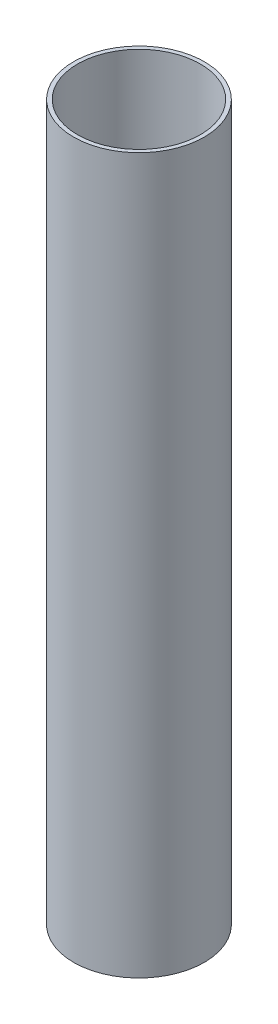
ISO-10303-21;
HEADER;
FILE_DESCRIPTION(('STEP AP214'),'2;1');
FILE_NAME('part.step','',(''),(''),'','','');
FILE_SCHEMA(('AUTOMOTIVE_DESIGN { 1 0 10303 214 1 1 1 1 }'));
ENDSEC;
DATA;
#1=APPLICATION_CONTEXT('core data for automotive mechanical design processes');
#2=APPLICATION_PROTOCOL_DEFINITION('international standard','automotive_design',2000,#1);
#3=PRODUCT_CONTEXT('',#1,'mechanical');
#4=PRODUCT('Part','Part','',(#3));
#5=PRODUCT_RELATED_PRODUCT_CATEGORY('part','',(#4));
#6=PRODUCT_DEFINITION_FORMATION('','',#4);
#7=PRODUCT_DEFINITION_CONTEXT('part definition',#1,'design');
#8=PRODUCT_DEFINITION('design','',#6,#7);
#9=PRODUCT_DEFINITION_SHAPE('','',#8);
#10=(LENGTH_UNIT() NAMED_UNIT(*) SI_UNIT(.MILLI.,.METRE.));
#11=(NAMED_UNIT(*) PLANE_ANGLE_UNIT() SI_UNIT($,.RADIAN.));
#12=(NAMED_UNIT(*) SI_UNIT($,.STERADIAN.) SOLID_ANGLE_UNIT());
#13=UNCERTAINTY_MEASURE_WITH_UNIT(LENGTH_MEASURE(1.E-05),#10,'distance_accuracy_value','');
#14=(GEOMETRIC_REPRESENTATION_CONTEXT(3) GLOBAL_UNCERTAINTY_ASSIGNED_CONTEXT((#13)) GLOBAL_UNIT_ASSIGNED_CONTEXT((#10,
#11,#12)) REPRESENTATION_CONTEXT('',''));
#15=CARTESIAN_POINT('',(0.,0.,0.));
#16=DIRECTION('',(0.,0.,1.));
#17=DIRECTION('',(1.,0.,0.));
#18=AXIS2_PLACEMENT_3D('',#15,#16,#17);
#19=CARTESIAN_POINT('',(0.,295.275,0.));
#20=DIRECTION('',(0.,1.,0.));
#21=DIRECTION('',(0.,0.,1.));
#22=AXIS2_PLACEMENT_3D('',#19,#20,#21);
#23=PLANE('',#22);
#24=CARTESIAN_POINT('',(0.,295.275,0.));
#25=DIRECTION('',(0.,1.,0.));
#26=DIRECTION('',(0.,0.,1.));
#27=AXIS2_PLACEMENT_3D('',#24,#25,#26);
#28=CIRCLE('',#27,27.);
#29=CARTESIAN_POINT('',(0.,295.275,27.));
#30=VERTEX_POINT('',#29);
#31=EDGE_CURVE('E10',#30,#30,#28,.T.);
#32=ORIENTED_EDGE('',*,*,#31,.T.);
#33=EDGE_LOOP('',(#32));
#34=FACE_BOUND('',#33,.T.);
#35=CARTESIAN_POINT('',(0.,295.275,0.));
#36=DIRECTION('',(0.,1.,0.));
#37=DIRECTION('',(0.,0.,1.));
#38=AXIS2_PLACEMENT_3D('',#35,#36,#37);
#39=CIRCLE('',#38,25.35);
#40=CARTESIAN_POINT('',(0.,295.275,25.35));
#41=VERTEX_POINT('',#40);
#42=EDGE_CURVE('E47',#41,#41,#39,.T.);
#43=ORIENTED_EDGE('',*,*,#42,.F.);
#44=EDGE_LOOP('',(#43));
#45=FACE_BOUND('',#44,.T.);
#46=ADVANCED_FACE('F36',(#34,#45),#23,.T.);
#47=CARTESIAN_POINT('',(0.,0.,0.));
#48=DIRECTION('',(0.,1.,0.));
#49=DIRECTION('',(0.,0.,1.));
#50=AXIS2_PLACEMENT_3D('',#47,#48,#49);
#51=PLANE('',#50);
#52=CARTESIAN_POINT('',(0.,0.,0.));
#53=DIRECTION('',(0.,1.,0.));
#54=DIRECTION('',(0.,0.,1.));
#55=AXIS2_PLACEMENT_3D('',#52,#53,#54);
#56=CIRCLE('',#55,27.);
#57=CARTESIAN_POINT('',(0.,0.,27.));
#58=VERTEX_POINT('',#57);
#59=EDGE_CURVE('E40',#58,#58,#56,.T.);
#60=ORIENTED_EDGE('',*,*,#59,.F.);
#61=EDGE_LOOP('',(#60));
#62=FACE_BOUND('',#61,.T.);
#63=CARTESIAN_POINT('',(0.,0.,0.));
#64=DIRECTION('',(0.,1.,0.));
#65=DIRECTION('',(0.,0.,1.));
#66=AXIS2_PLACEMENT_3D('',#63,#64,#65);
#67=CIRCLE('',#66,25.35);
#68=CARTESIAN_POINT('',(0.,0.,25.35));
#69=VERTEX_POINT('',#68);
#70=EDGE_CURVE('E49',#69,#69,#67,.T.);
#71=ORIENTED_EDGE('',*,*,#70,.T.);
#72=EDGE_LOOP('',(#71));
#73=FACE_BOUND('',#72,.T.);
#74=ADVANCED_FACE('F59',(#62,#73),#51,.F.);
#75=CARTESIAN_POINT('',(0.,295.275,0.));
#76=DIRECTION('',(0.,-1.,0.));
#77=DIRECTION('',(0.,0.,-1.));
#78=AXIS2_PLACEMENT_3D('',#75,#76,#77);
#79=CYLINDRICAL_SURFACE('',#78,27.);
#80=ORIENTED_EDGE('',*,*,#31,.F.);
#81=EDGE_LOOP('',(#80));
#82=FACE_BOUND('',#81,.T.);
#83=ORIENTED_EDGE('',*,*,#59,.T.);
#84=EDGE_LOOP('',(#83));
#85=FACE_BOUND('',#84,.T.);
#86=ADVANCED_FACE('F38',(#82,#85),#79,.T.);
#87=CARTESIAN_POINT('',(0.,295.275,0.));
#88=DIRECTION('',(0.,-1.,0.));
#89=DIRECTION('',(0.,0.,-1.));
#90=AXIS2_PLACEMENT_3D('',#87,#88,#89);
#91=CYLINDRICAL_SURFACE('',#90,25.35);
#92=ORIENTED_EDGE('',*,*,#42,.T.);
#93=EDGE_LOOP('',(#92));
#94=FACE_BOUND('',#93,.T.);
#95=ORIENTED_EDGE('',*,*,#70,.F.);
#96=EDGE_LOOP('',(#95));
#97=FACE_BOUND('',#96,.T.);
#98=ADVANCED_FACE('F55',(#94,#97),#91,.F.);
#99=CLOSED_SHELL('',(#46,#74,#86,#98));
#100=MANIFOLD_SOLID_BREP('B2',#99);
#101=ADVANCED_BREP_SHAPE_REPRESENTATION('',(#18,#100),#14);
#102=SHAPE_DEFINITION_REPRESENTATION(#9,#101);
ENDSEC;
END-ISO-10303-21;
